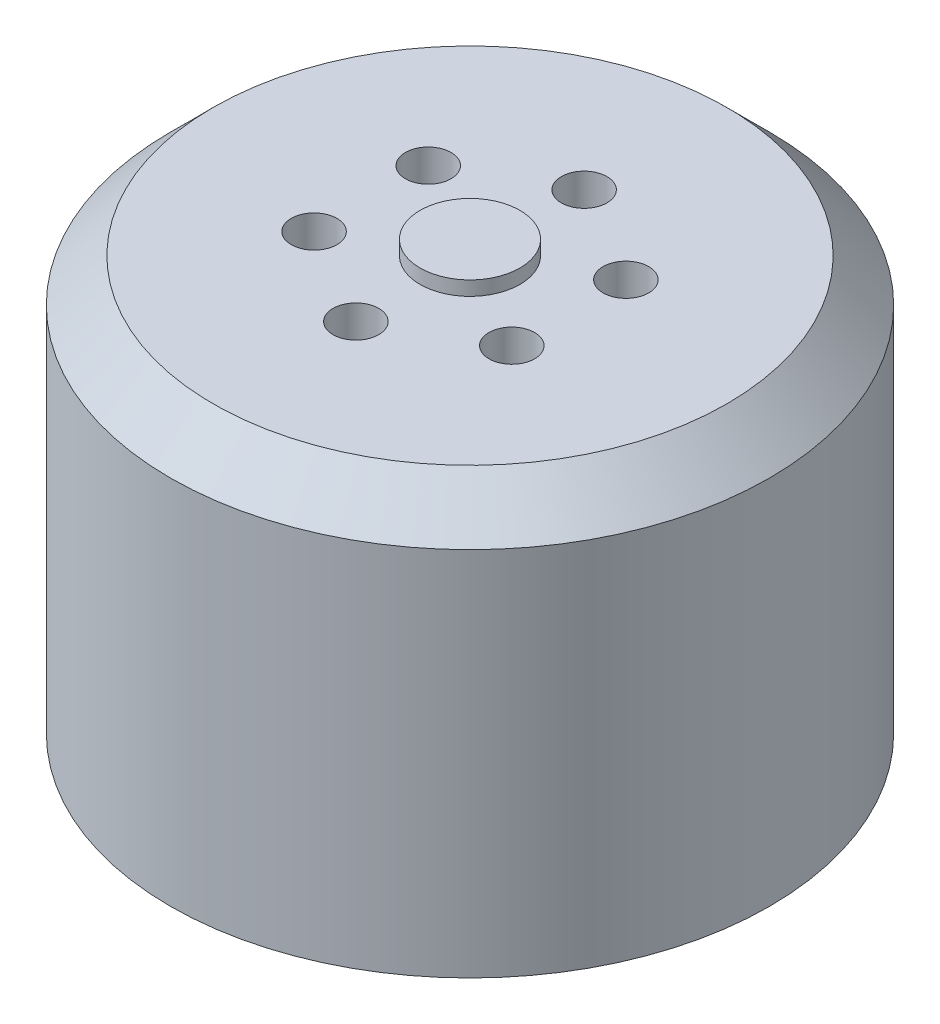
ISO-10303-21;
HEADER;
FILE_DESCRIPTION(('STEP AP214'),'2;1');
FILE_NAME('part.step','',(''),(''),'','','');
FILE_SCHEMA(('AUTOMOTIVE_DESIGN { 1 0 10303 214 1 1 1 1 }'));
ENDSEC;
DATA;
#1=APPLICATION_CONTEXT('core data for automotive mechanical design processes');
#2=APPLICATION_PROTOCOL_DEFINITION('international standard','automotive_design',2000,#1);
#3=PRODUCT_CONTEXT('',#1,'mechanical');
#4=PRODUCT('Part','Part','',(#3));
#5=PRODUCT_RELATED_PRODUCT_CATEGORY('part','',(#4));
#6=PRODUCT_DEFINITION_FORMATION('','',#4);
#7=PRODUCT_DEFINITION_CONTEXT('part definition',#1,'design');
#8=PRODUCT_DEFINITION('design','',#6,#7);
#9=PRODUCT_DEFINITION_SHAPE('','',#8);
#10=(LENGTH_UNIT() NAMED_UNIT(*) SI_UNIT(.MILLI.,.METRE.));
#11=(NAMED_UNIT(*) PLANE_ANGLE_UNIT() SI_UNIT($,.RADIAN.));
#12=(NAMED_UNIT(*) SI_UNIT($,.STERADIAN.) SOLID_ANGLE_UNIT());
#13=UNCERTAINTY_MEASURE_WITH_UNIT(LENGTH_MEASURE(1.E-05),#10,'distance_accuracy_value','');
#14=(GEOMETRIC_REPRESENTATION_CONTEXT(3) GLOBAL_UNCERTAINTY_ASSIGNED_CONTEXT((#13)) GLOBAL_UNIT_ASSIGNED_CONTEXT((#10,
#11,#12)) REPRESENTATION_CONTEXT('',''));
#15=CARTESIAN_POINT('',(0.,0.,0.));
#16=DIRECTION('',(0.,0.,1.));
#17=DIRECTION('',(1.,0.,0.));
#18=AXIS2_PLACEMENT_3D('',#15,#16,#17);
#19=CARTESIAN_POINT('',(-10.,0.,0.));
#20=DIRECTION('',(0.,1.,0.));
#21=DIRECTION('',(-1.,0.,0.));
#22=AXIS2_PLACEMENT_3D('',#19,#20,#21);
#23=PLANE('',#22);
#24=CARTESIAN_POINT('',(0.,0.,0.));
#25=DIRECTION('',(0.,-1.,0.));
#26=DIRECTION('',(1.,0.,0.));
#27=AXIS2_PLACEMENT_3D('',#24,#25,#26);
#28=CIRCLE('',#27,10.);
#29=CARTESIAN_POINT('',(10.,0.,0.));
#30=VERTEX_POINT('',#29);
#31=EDGE_CURVE('E59',#30,#30,#28,.T.);
#32=ORIENTED_EDGE('',*,*,#31,.T.);
#33=EDGE_LOOP('',(#32));
#34=FACE_BOUND('',#33,.T.);
#35=ADVANCED_FACE('F37',(#34),#23,.F.);
#36=CARTESIAN_POINT('',(0.,30.5,0.));
#37=DIRECTION('',(0.,-1.,0.));
#38=DIRECTION('',(1.,0.,0.));
#39=AXIS2_PLACEMENT_3D('',#36,#37,#38);
#40=PLANE('',#39);
#41=CARTESIAN_POINT('',(0.,30.5,0.));
#42=DIRECTION('',(0.,-1.,0.));
#43=DIRECTION('',(1.,0.,0.));
#44=AXIS2_PLACEMENT_3D('',#41,#42,#43);
#45=CIRCLE('',#44,3.5);
#46=CARTESIAN_POINT('',(3.5,30.5,0.));
#47=VERTEX_POINT('',#46);
#48=EDGE_CURVE('E10',#47,#47,#45,.F.);
#49=ORIENTED_EDGE('',*,*,#48,.F.);
#50=EDGE_LOOP('',(#49));
#51=FACE_BOUND('',#50,.T.);
#52=CARTESIAN_POINT('',(0.,30.5,-8.));
#53=DIRECTION('',(0.,1.,0.));
#54=DIRECTION('',(0.,0.,1.));
#55=AXIS2_PLACEMENT_3D('',#52,#53,#54);
#56=CIRCLE('',#55,1.6);
#57=CARTESIAN_POINT('',(0.,30.5,-6.4));
#58=VERTEX_POINT('',#57);
#59=EDGE_CURVE('E88',#58,#58,#56,.T.);
#60=ORIENTED_EDGE('',*,*,#59,.F.);
#61=EDGE_LOOP('',(#60));
#62=FACE_BOUND('',#61,.T.);
#63=CARTESIAN_POINT('',(-6.92820323027551,30.5,-4.));
#64=DIRECTION('',(0.,1.,0.));
#65=DIRECTION('',(0.,0.,1.));
#66=AXIS2_PLACEMENT_3D('',#63,#64,#65);
#67=CIRCLE('',#66,1.6);
#68=CARTESIAN_POINT('',(-6.92820323027551,30.5,-2.4));
#69=VERTEX_POINT('',#68);
#70=EDGE_CURVE('E67',#69,#69,#67,.T.);
#71=ORIENTED_EDGE('',*,*,#70,.F.);
#72=EDGE_LOOP('',(#71));
#73=FACE_BOUND('',#72,.T.);
#74=CARTESIAN_POINT('',(-6.92820323027551,30.5,4.));
#75=DIRECTION('',(0.,1.,0.));
#76=DIRECTION('',(0.,0.,1.));
#77=AXIS2_PLACEMENT_3D('',#74,#75,#76);
#78=CIRCLE('',#77,1.6);
#79=CARTESIAN_POINT('',(-6.92820323027551,30.5,5.6));
#80=VERTEX_POINT('',#79);
#81=EDGE_CURVE('E66',#80,#80,#78,.T.);
#82=ORIENTED_EDGE('',*,*,#81,.F.);
#83=EDGE_LOOP('',(#82));
#84=FACE_BOUND('',#83,.T.);
#85=CARTESIAN_POINT('',(0.,30.5,8.));
#86=DIRECTION('',(0.,1.,0.));
#87=DIRECTION('',(0.,0.,1.));
#88=AXIS2_PLACEMENT_3D('',#85,#86,#87);
#89=CIRCLE('',#88,1.6);
#90=CARTESIAN_POINT('',(0.,30.5,9.6));
#91=VERTEX_POINT('',#90);
#92=EDGE_CURVE('E73',#91,#91,#89,.T.);
#93=ORIENTED_EDGE('',*,*,#92,.F.);
#94=EDGE_LOOP('',(#93));
#95=FACE_BOUND('',#94,.T.);
#96=CARTESIAN_POINT('',(6.92820323027551,30.5,4.));
#97=DIRECTION('',(0.,1.,0.));
#98=DIRECTION('',(0.,0.,1.));
#99=AXIS2_PLACEMENT_3D('',#96,#97,#98);
#100=CIRCLE('',#99,1.6);
#101=CARTESIAN_POINT('',(6.92820323027551,30.5,5.6));
#102=VERTEX_POINT('',#101);
#103=EDGE_CURVE('E79',#102,#102,#100,.T.);
#104=ORIENTED_EDGE('',*,*,#103,.F.);
#105=EDGE_LOOP('',(#104));
#106=FACE_BOUND('',#105,.T.);
#107=CARTESIAN_POINT('',(6.92820323027551,30.5,-4.));
#108=DIRECTION('',(0.,1.,0.));
#109=DIRECTION('',(0.,0.,1.));
#110=AXIS2_PLACEMENT_3D('',#107,#108,#109);
#111=CIRCLE('',#110,1.6);
#112=CARTESIAN_POINT('',(6.92820323027551,30.5,-2.4));
#113=VERTEX_POINT('',#112);
#114=EDGE_CURVE('E85',#113,#113,#111,.T.);
#115=ORIENTED_EDGE('',*,*,#114,.F.);
#116=EDGE_LOOP('',(#115));
#117=FACE_BOUND('',#116,.T.);
#118=CARTESIAN_POINT('',(0.,30.5,0.));
#119=DIRECTION('',(0.,-1.,0.));
#120=DIRECTION('',(1.,0.,0.));
#121=AXIS2_PLACEMENT_3D('',#118,#119,#120);
#122=CIRCLE('',#121,18.);
#123=CARTESIAN_POINT('',(18.,30.5,0.));
#124=VERTEX_POINT('',#123);
#125=EDGE_CURVE('E43',#124,#124,#122,.T.);
#126=ORIENTED_EDGE('',*,*,#125,.F.);
#127=EDGE_LOOP('',(#126));
#128=FACE_BOUND('',#127,.T.);
#129=ADVANCED_FACE('F142',(#51,#62,#73,#84,#95,#106,#117,#128),#40,.F.);
#130=CARTESIAN_POINT('',(0.,30.5,0.));
#131=DIRECTION('',(0.,-1.,0.));
#132=DIRECTION('',(1.,0.,0.));
#133=AXIS2_PLACEMENT_3D('',#130,#131,#132);
#134=CONICAL_SURFACE('',#133,18.,0.785398163397448);
#135=CARTESIAN_POINT('',(0.,27.5,0.));
#136=DIRECTION('',(0.,-1.,0.));
#137=DIRECTION('',(1.,0.,0.));
#138=AXIS2_PLACEMENT_3D('',#135,#136,#137);
#139=CIRCLE('',#138,21.);
#140=CARTESIAN_POINT('',(21.,27.5,0.));
#141=VERTEX_POINT('',#140);
#142=EDGE_CURVE('E47',#141,#141,#139,.T.);
#143=ORIENTED_EDGE('',*,*,#142,.F.);
#144=EDGE_LOOP('',(#143));
#145=FACE_BOUND('',#144,.T.);
#146=ORIENTED_EDGE('',*,*,#125,.T.);
#147=EDGE_LOOP('',(#146));
#148=FACE_BOUND('',#147,.T.);
#149=ADVANCED_FACE('F147',(#145,#148),#134,.T.);
#150=CARTESIAN_POINT('',(0.,0.,0.));
#151=DIRECTION('',(0.,-1.,0.));
#152=DIRECTION('',(1.,0.,0.));
#153=AXIS2_PLACEMENT_3D('',#150,#151,#152);
#154=CYLINDRICAL_SURFACE('',#153,21.);
#155=CARTESIAN_POINT('',(0.,1.5,0.));
#156=DIRECTION('',(0.,-1.,0.));
#157=DIRECTION('',(1.,0.,0.));
#158=AXIS2_PLACEMENT_3D('',#155,#156,#157);
#159=CIRCLE('',#158,21.);
#160=CARTESIAN_POINT('',(21.,1.5,0.));
#161=VERTEX_POINT('',#160);
#162=EDGE_CURVE('E51',#161,#161,#159,.T.);
#163=ORIENTED_EDGE('',*,*,#162,.F.);
#164=EDGE_LOOP('',(#163));
#165=FACE_BOUND('',#164,.T.);
#166=ORIENTED_EDGE('',*,*,#142,.T.);
#167=EDGE_LOOP('',(#166));
#168=FACE_BOUND('',#167,.T.);
#169=ADVANCED_FACE('F161',(#165,#168),#154,.T.);
#170=CARTESIAN_POINT('',(-21.,1.5,0.));
#171=DIRECTION('',(0.,1.,0.));
#172=DIRECTION('',(-1.,0.,0.));
#173=AXIS2_PLACEMENT_3D('',#170,#171,#172);
#174=PLANE('',#173);
#175=CARTESIAN_POINT('',(0.,1.5,18.));
#176=DIRECTION('',(0.,-1.,0.));
#177=DIRECTION('',(0.,0.,-1.));
#178=AXIS2_PLACEMENT_3D('',#175,#176,#177);
#179=CIRCLE('',#178,1.6);
#180=CARTESIAN_POINT('',(0.,1.5,16.4));
#181=VERTEX_POINT('',#180);
#182=EDGE_CURVE('E118',#181,#181,#179,.T.);
#183=ORIENTED_EDGE('',*,*,#182,.F.);
#184=EDGE_LOOP('',(#183));
#185=FACE_BOUND('',#184,.T.);
#186=CARTESIAN_POINT('',(18.,1.5,0.));
#187=DIRECTION('',(0.,-1.,0.));
#188=DIRECTION('',(0.,0.,-1.));
#189=AXIS2_PLACEMENT_3D('',#186,#187,#188);
#190=CIRCLE('',#189,1.6);
#191=CARTESIAN_POINT('',(18.,1.5,-1.6));
#192=VERTEX_POINT('',#191);
#193=EDGE_CURVE('E115',#192,#192,#190,.T.);
#194=ORIENTED_EDGE('',*,*,#193,.F.);
#195=EDGE_LOOP('',(#194));
#196=FACE_BOUND('',#195,.T.);
#197=CARTESIAN_POINT('',(0.,1.5,-18.));
#198=DIRECTION('',(0.,-1.,0.));
#199=DIRECTION('',(0.,0.,-1.));
#200=AXIS2_PLACEMENT_3D('',#197,#198,#199);
#201=CIRCLE('',#200,1.6);
#202=CARTESIAN_POINT('',(0.,1.5,-19.6));
#203=VERTEX_POINT('',#202);
#204=EDGE_CURVE('E109',#203,#203,#201,.T.);
#205=ORIENTED_EDGE('',*,*,#204,.F.);
#206=EDGE_LOOP('',(#205));
#207=FACE_BOUND('',#206,.T.);
#208=CARTESIAN_POINT('',(-18.,1.5,0.));
#209=DIRECTION('',(0.,-1.,0.));
#210=DIRECTION('',(0.,0.,-1.));
#211=AXIS2_PLACEMENT_3D('',#208,#209,#210);
#212=CIRCLE('',#211,1.6);
#213=CARTESIAN_POINT('',(-18.,1.5,-1.6));
#214=VERTEX_POINT('',#213);
#215=EDGE_CURVE('E102',#214,#214,#212,.T.);
#216=ORIENTED_EDGE('',*,*,#215,.F.);
#217=EDGE_LOOP('',(#216));
#218=FACE_BOUND('',#217,.T.);
#219=CARTESIAN_POINT('',(0.,1.5,0.));
#220=DIRECTION('',(0.,-1.,0.));
#221=DIRECTION('',(1.,0.,0.));
#222=AXIS2_PLACEMENT_3D('',#219,#220,#221);
#223=CIRCLE('',#222,10.);
#224=CARTESIAN_POINT('',(10.,1.5,0.));
#225=VERTEX_POINT('',#224);
#226=EDGE_CURVE('E56',#225,#225,#223,.T.);
#227=ORIENTED_EDGE('',*,*,#226,.F.);
#228=EDGE_LOOP('',(#227));
#229=FACE_BOUND('',#228,.T.);
#230=ORIENTED_EDGE('',*,*,#162,.T.);
#231=EDGE_LOOP('',(#230));
#232=FACE_BOUND('',#231,.T.);
#233=ADVANCED_FACE('F155',(#185,#196,#207,#218,#229,#232),#174,.F.);
#234=CARTESIAN_POINT('',(0.,0.,0.));
#235=DIRECTION('',(0.,-1.,0.));
#236=DIRECTION('',(1.,0.,0.));
#237=AXIS2_PLACEMENT_3D('',#234,#235,#236);
#238=CYLINDRICAL_SURFACE('',#237,10.);
#239=ORIENTED_EDGE('',*,*,#31,.F.);
#240=EDGE_LOOP('',(#239));
#241=FACE_BOUND('',#240,.T.);
#242=ORIENTED_EDGE('',*,*,#226,.T.);
#243=EDGE_LOOP('',(#242));
#244=FACE_BOUND('',#243,.T.);
#245=ADVANCED_FACE('F151',(#241,#244),#238,.T.);
#246=CARTESIAN_POINT('',(6.92820323027551,25.5,-4.));
#247=DIRECTION('',(0.,1.,0.));
#248=DIRECTION('',(0.,0.,1.));
#249=AXIS2_PLACEMENT_3D('',#246,#247,#248);
#250=CYLINDRICAL_SURFACE('',#249,1.6);
#251=CARTESIAN_POINT('',(6.92820323027551,25.5,-4.));
#252=DIRECTION('',(0.,1.,0.));
#253=DIRECTION('',(0.,0.,1.));
#254=AXIS2_PLACEMENT_3D('',#251,#252,#253);
#255=CIRCLE('',#254,1.6);
#256=CARTESIAN_POINT('',(6.92820323027551,25.5,-2.4));
#257=VERTEX_POINT('',#256);
#258=EDGE_CURVE('E82',#257,#257,#255,.T.);
#259=ORIENTED_EDGE('',*,*,#258,.F.);
#260=EDGE_LOOP('',(#259));
#261=FACE_BOUND('',#260,.T.);
#262=ORIENTED_EDGE('',*,*,#114,.T.);
#263=EDGE_LOOP('',(#262));
#264=FACE_BOUND('',#263,.T.);
#265=ADVANCED_FACE('F154',(#261,#264),#250,.F.);
#266=CARTESIAN_POINT('',(6.92820323027551,25.5,-4.));
#267=DIRECTION('',(0.,1.,0.));
#268=DIRECTION('',(0.,0.,1.));
#269=AXIS2_PLACEMENT_3D('',#266,#267,#268);
#270=PLANE('',#269);
#271=ORIENTED_EDGE('',*,*,#258,.T.);
#272=EDGE_LOOP('',(#271));
#273=FACE_BOUND('',#272,.T.);
#274=ADVANCED_FACE('F199',(#273),#270,.T.);
#275=CARTESIAN_POINT('',(6.92820323027551,25.5,4.));
#276=DIRECTION('',(0.,1.,0.));
#277=DIRECTION('',(0.,0.,1.));
#278=AXIS2_PLACEMENT_3D('',#275,#276,#277);
#279=CYLINDRICAL_SURFACE('',#278,1.6);
#280=CARTESIAN_POINT('',(6.92820323027551,25.5,4.));
#281=DIRECTION('',(0.,1.,0.));
#282=DIRECTION('',(0.,0.,1.));
#283=AXIS2_PLACEMENT_3D('',#280,#281,#282);
#284=CIRCLE('',#283,1.6);
#285=CARTESIAN_POINT('',(6.92820323027551,25.5,5.6));
#286=VERTEX_POINT('',#285);
#287=EDGE_CURVE('E76',#286,#286,#284,.T.);
#288=ORIENTED_EDGE('',*,*,#287,.F.);
#289=EDGE_LOOP('',(#288));
#290=FACE_BOUND('',#289,.T.);
#291=ORIENTED_EDGE('',*,*,#103,.T.);
#292=EDGE_LOOP('',(#291));
#293=FACE_BOUND('',#292,.T.);
#294=ADVANCED_FACE('F195',(#290,#293),#279,.F.);
#295=CARTESIAN_POINT('',(6.92820323027551,25.5,4.));
#296=DIRECTION('',(0.,1.,0.));
#297=DIRECTION('',(0.,0.,1.));
#298=AXIS2_PLACEMENT_3D('',#295,#296,#297);
#299=PLANE('',#298);
#300=ORIENTED_EDGE('',*,*,#287,.T.);
#301=EDGE_LOOP('',(#300));
#302=FACE_BOUND('',#301,.T.);
#303=ADVANCED_FACE('F191',(#302),#299,.T.);
#304=CARTESIAN_POINT('',(0.,25.5,8.));
#305=DIRECTION('',(0.,1.,0.));
#306=DIRECTION('',(0.,0.,1.));
#307=AXIS2_PLACEMENT_3D('',#304,#305,#306);
#308=CYLINDRICAL_SURFACE('',#307,1.6);
#309=CARTESIAN_POINT('',(0.,25.5,8.));
#310=DIRECTION('',(0.,1.,0.));
#311=DIRECTION('',(0.,0.,1.));
#312=AXIS2_PLACEMENT_3D('',#309,#310,#311);
#313=CIRCLE('',#312,1.6);
#314=CARTESIAN_POINT('',(0.,25.5,9.6));
#315=VERTEX_POINT('',#314);
#316=EDGE_CURVE('E70',#315,#315,#313,.T.);
#317=ORIENTED_EDGE('',*,*,#316,.F.);
#318=EDGE_LOOP('',(#317));
#319=FACE_BOUND('',#318,.T.);
#320=ORIENTED_EDGE('',*,*,#92,.T.);
#321=EDGE_LOOP('',(#320));
#322=FACE_BOUND('',#321,.T.);
#323=ADVANCED_FACE('F187',(#319,#322),#308,.F.);
#324=CARTESIAN_POINT('',(0.,25.5,8.));
#325=DIRECTION('',(0.,1.,0.));
#326=DIRECTION('',(0.,0.,1.));
#327=AXIS2_PLACEMENT_3D('',#324,#325,#326);
#328=PLANE('',#327);
#329=ORIENTED_EDGE('',*,*,#316,.T.);
#330=EDGE_LOOP('',(#329));
#331=FACE_BOUND('',#330,.T.);
#332=ADVANCED_FACE('F183',(#331),#328,.T.);
#333=CARTESIAN_POINT('',(-6.92820323027551,25.5,4.));
#334=DIRECTION('',(0.,1.,0.));
#335=DIRECTION('',(0.,0.,1.));
#336=AXIS2_PLACEMENT_3D('',#333,#334,#335);
#337=CYLINDRICAL_SURFACE('',#336,1.6);
#338=CARTESIAN_POINT('',(-6.92820323027551,25.5,4.));
#339=DIRECTION('',(0.,1.,0.));
#340=DIRECTION('',(0.,0.,1.));
#341=AXIS2_PLACEMENT_3D('',#338,#339,#340);
#342=CIRCLE('',#341,1.6);
#343=CARTESIAN_POINT('',(-6.92820323027551,25.5,5.6));
#344=VERTEX_POINT('',#343);
#345=EDGE_CURVE('E63',#344,#344,#342,.T.);
#346=ORIENTED_EDGE('',*,*,#345,.F.);
#347=EDGE_LOOP('',(#346));
#348=FACE_BOUND('',#347,.T.);
#349=ORIENTED_EDGE('',*,*,#81,.T.);
#350=EDGE_LOOP('',(#349));
#351=FACE_BOUND('',#350,.T.);
#352=ADVANCED_FACE('F179',(#348,#351),#337,.F.);
#353=CARTESIAN_POINT('',(-6.92820323027551,25.5,4.));
#354=DIRECTION('',(0.,1.,0.));
#355=DIRECTION('',(0.,0.,1.));
#356=AXIS2_PLACEMENT_3D('',#353,#354,#355);
#357=PLANE('',#356);
#358=ORIENTED_EDGE('',*,*,#345,.T.);
#359=EDGE_LOOP('',(#358));
#360=FACE_BOUND('',#359,.T.);
#361=ADVANCED_FACE('F175',(#360),#357,.T.);
#362=CARTESIAN_POINT('',(-6.92820323027551,25.5,-4.));
#363=DIRECTION('',(0.,1.,0.));
#364=DIRECTION('',(0.,0.,1.));
#365=AXIS2_PLACEMENT_3D('',#362,#363,#364);
#366=CYLINDRICAL_SURFACE('',#365,1.6);
#367=CARTESIAN_POINT('',(-6.92820323027551,25.5,-4.));
#368=DIRECTION('',(0.,1.,0.));
#369=DIRECTION('',(0.,0.,1.));
#370=AXIS2_PLACEMENT_3D('',#367,#368,#369);
#371=CIRCLE('',#370,1.6);
#372=CARTESIAN_POINT('',(-6.92820323027551,25.5,-2.4));
#373=VERTEX_POINT('',#372);
#374=EDGE_CURVE('E89',#373,#373,#371,.T.);
#375=ORIENTED_EDGE('',*,*,#374,.F.);
#376=EDGE_LOOP('',(#375));
#377=FACE_BOUND('',#376,.T.);
#378=ORIENTED_EDGE('',*,*,#70,.T.);
#379=EDGE_LOOP('',(#378));
#380=FACE_BOUND('',#379,.T.);
#381=ADVANCED_FACE('F178',(#377,#380),#366,.F.);
#382=CARTESIAN_POINT('',(-6.92820323027551,25.5,-4.));
#383=DIRECTION('',(0.,1.,0.));
#384=DIRECTION('',(0.,0.,1.));
#385=AXIS2_PLACEMENT_3D('',#382,#383,#384);
#386=PLANE('',#385);
#387=ORIENTED_EDGE('',*,*,#374,.T.);
#388=EDGE_LOOP('',(#387));
#389=FACE_BOUND('',#388,.T.);
#390=ADVANCED_FACE('F207',(#389),#386,.T.);
#391=CARTESIAN_POINT('',(0.,25.5,-8.));
#392=DIRECTION('',(0.,1.,0.));
#393=DIRECTION('',(0.,0.,1.));
#394=AXIS2_PLACEMENT_3D('',#391,#392,#393);
#395=CYLINDRICAL_SURFACE('',#394,1.6);
#396=CARTESIAN_POINT('',(0.,25.5,-8.));
#397=DIRECTION('',(0.,1.,0.));
#398=DIRECTION('',(0.,0.,1.));
#399=AXIS2_PLACEMENT_3D('',#396,#397,#398);
#400=CIRCLE('',#399,1.6);
#401=CARTESIAN_POINT('',(0.,25.5,-6.4));
#402=VERTEX_POINT('',#401);
#403=EDGE_CURVE('E62',#402,#402,#400,.T.);
#404=ORIENTED_EDGE('',*,*,#403,.F.);
#405=EDGE_LOOP('',(#404));
#406=FACE_BOUND('',#405,.T.);
#407=ORIENTED_EDGE('',*,*,#59,.T.);
#408=EDGE_LOOP('',(#407));
#409=FACE_BOUND('',#408,.T.);
#410=ADVANCED_FACE('F210',(#406,#409),#395,.F.);
#411=CARTESIAN_POINT('',(0.,25.5,-8.));
#412=DIRECTION('',(0.,1.,0.));
#413=DIRECTION('',(0.,0.,1.));
#414=AXIS2_PLACEMENT_3D('',#411,#412,#413);
#415=PLANE('',#414);
#416=ORIENTED_EDGE('',*,*,#403,.T.);
#417=EDGE_LOOP('',(#416));
#418=FACE_BOUND('',#417,.T.);
#419=ADVANCED_FACE('F217',(#418),#415,.T.);
#420=CARTESIAN_POINT('',(-18.,6.5,0.));
#421=DIRECTION('',(0.,-1.,0.));
#422=DIRECTION('',(0.,0.,-1.));
#423=AXIS2_PLACEMENT_3D('',#420,#421,#422);
#424=CYLINDRICAL_SURFACE('',#423,1.6);
#425=CARTESIAN_POINT('',(-18.,6.5,0.));
#426=DIRECTION('',(0.,-1.,0.));
#427=DIRECTION('',(0.,0.,-1.));
#428=AXIS2_PLACEMENT_3D('',#425,#426,#427);
#429=CIRCLE('',#428,1.6);
#430=CARTESIAN_POINT('',(-18.,6.5,-1.6));
#431=VERTEX_POINT('',#430);
#432=EDGE_CURVE('E99',#431,#431,#429,.T.);
#433=ORIENTED_EDGE('',*,*,#432,.F.);
#434=EDGE_LOOP('',(#433));
#435=FACE_BOUND('',#434,.T.);
#436=ORIENTED_EDGE('',*,*,#215,.T.);
#437=EDGE_LOOP('',(#436));
#438=FACE_BOUND('',#437,.T.);
#439=ADVANCED_FACE('F221',(#435,#438),#424,.F.);
#440=CARTESIAN_POINT('',(-18.,6.5,0.));
#441=DIRECTION('',(0.,-1.,0.));
#442=DIRECTION('',(0.,0.,-1.));
#443=AXIS2_PLACEMENT_3D('',#440,#441,#442);
#444=PLANE('',#443);
#445=ORIENTED_EDGE('',*,*,#432,.T.);
#446=EDGE_LOOP('',(#445));
#447=FACE_BOUND('',#446,.T.);
#448=ADVANCED_FACE('F223',(#447),#444,.T.);
#449=CARTESIAN_POINT('',(0.,6.5,-18.));
#450=DIRECTION('',(0.,-1.,0.));
#451=DIRECTION('',(0.,0.,-1.));
#452=AXIS2_PLACEMENT_3D('',#449,#450,#451);
#453=CYLINDRICAL_SURFACE('',#452,1.6);
#454=CARTESIAN_POINT('',(0.,6.5,-18.));
#455=DIRECTION('',(0.,-1.,0.));
#456=DIRECTION('',(0.,0.,-1.));
#457=AXIS2_PLACEMENT_3D('',#454,#455,#456);
#458=CIRCLE('',#457,1.6);
#459=CARTESIAN_POINT('',(0.,6.5,-19.6));
#460=VERTEX_POINT('',#459);
#461=EDGE_CURVE('E106',#460,#460,#458,.T.);
#462=ORIENTED_EDGE('',*,*,#461,.F.);
#463=EDGE_LOOP('',(#462));
#464=FACE_BOUND('',#463,.T.);
#465=ORIENTED_EDGE('',*,*,#204,.T.);
#466=EDGE_LOOP('',(#465));
#467=FACE_BOUND('',#466,.T.);
#468=ADVANCED_FACE('F226',(#464,#467),#453,.F.);
#469=CARTESIAN_POINT('',(0.,6.5,-18.));
#470=DIRECTION('',(0.,-1.,0.));
#471=DIRECTION('',(0.,0.,-1.));
#472=AXIS2_PLACEMENT_3D('',#469,#470,#471);
#473=PLANE('',#472);
#474=ORIENTED_EDGE('',*,*,#461,.T.);
#475=EDGE_LOOP('',(#474));
#476=FACE_BOUND('',#475,.T.);
#477=ADVANCED_FACE('F231',(#476),#473,.T.);
#478=CARTESIAN_POINT('',(18.,6.5,0.));
#479=DIRECTION('',(0.,-1.,0.));
#480=DIRECTION('',(0.,0.,-1.));
#481=AXIS2_PLACEMENT_3D('',#478,#479,#480);
#482=CYLINDRICAL_SURFACE('',#481,1.6);
#483=CARTESIAN_POINT('',(18.,6.5,0.));
#484=DIRECTION('',(0.,-1.,0.));
#485=DIRECTION('',(0.,0.,-1.));
#486=AXIS2_PLACEMENT_3D('',#483,#484,#485);
#487=CIRCLE('',#486,1.6);
#488=CARTESIAN_POINT('',(18.,6.5,-1.6));
#489=VERTEX_POINT('',#488);
#490=EDGE_CURVE('E112',#489,#489,#487,.T.);
#491=ORIENTED_EDGE('',*,*,#490,.F.);
#492=EDGE_LOOP('',(#491));
#493=FACE_BOUND('',#492,.T.);
#494=ORIENTED_EDGE('',*,*,#193,.T.);
#495=EDGE_LOOP('',(#494));
#496=FACE_BOUND('',#495,.T.);
#497=ADVANCED_FACE('F234',(#493,#496),#482,.F.);
#498=CARTESIAN_POINT('',(18.,6.5,0.));
#499=DIRECTION('',(0.,-1.,0.));
#500=DIRECTION('',(0.,0.,-1.));
#501=AXIS2_PLACEMENT_3D('',#498,#499,#500);
#502=PLANE('',#501);
#503=ORIENTED_EDGE('',*,*,#490,.T.);
#504=EDGE_LOOP('',(#503));
#505=FACE_BOUND('',#504,.T.);
#506=ADVANCED_FACE('F239',(#505),#502,.T.);
#507=CARTESIAN_POINT('',(0.,6.5,18.));
#508=DIRECTION('',(0.,-1.,0.));
#509=DIRECTION('',(0.,0.,-1.));
#510=AXIS2_PLACEMENT_3D('',#507,#508,#509);
#511=CYLINDRICAL_SURFACE('',#510,1.6);
#512=CARTESIAN_POINT('',(0.,6.5,18.));
#513=DIRECTION('',(0.,-1.,0.));
#514=DIRECTION('',(0.,0.,-1.));
#515=AXIS2_PLACEMENT_3D('',#512,#513,#514);
#516=CIRCLE('',#515,1.6);
#517=CARTESIAN_POINT('',(0.,6.5,16.4));
#518=VERTEX_POINT('',#517);
#519=EDGE_CURVE('E92',#518,#518,#516,.T.);
#520=ORIENTED_EDGE('',*,*,#519,.F.);
#521=EDGE_LOOP('',(#520));
#522=FACE_BOUND('',#521,.T.);
#523=ORIENTED_EDGE('',*,*,#182,.T.);
#524=EDGE_LOOP('',(#523));
#525=FACE_BOUND('',#524,.T.);
#526=ADVANCED_FACE('F138',(#522,#525),#511,.F.);
#527=CARTESIAN_POINT('',(0.,6.5,18.));
#528=DIRECTION('',(0.,-1.,0.));
#529=DIRECTION('',(0.,0.,-1.));
#530=AXIS2_PLACEMENT_3D('',#527,#528,#529);
#531=PLANE('',#530);
#532=ORIENTED_EDGE('',*,*,#519,.T.);
#533=EDGE_LOOP('',(#532));
#534=FACE_BOUND('',#533,.T.);
#535=ADVANCED_FACE('F130',(#534),#531,.T.);
#536=CARTESIAN_POINT('',(0.,31.5,0.));
#537=DIRECTION('',(0.,-1.,0.));
#538=DIRECTION('',(0.,0.,-1.));
#539=AXIS2_PLACEMENT_3D('',#536,#537,#538);
#540=CYLINDRICAL_SURFACE('',#539,3.5);
#541=CARTESIAN_POINT('',(0.,31.5,0.));
#542=DIRECTION('',(0.,1.,0.));
#543=DIRECTION('',(0.,0.,1.));
#544=AXIS2_PLACEMENT_3D('',#541,#542,#543);
#545=CIRCLE('',#544,3.5);
#546=CARTESIAN_POINT('',(0.,31.5,3.5));
#547=VERTEX_POINT('',#546);
#548=EDGE_CURVE('E103',#547,#547,#545,.T.);
#549=ORIENTED_EDGE('',*,*,#548,.F.);
#550=EDGE_LOOP('',(#549));
#551=FACE_BOUND('',#550,.T.);
#552=ORIENTED_EDGE('',*,*,#48,.T.);
#553=EDGE_LOOP('',(#552));
#554=FACE_BOUND('',#553,.T.);
#555=ADVANCED_FACE('F128',(#551,#554),#540,.T.);
#556=CARTESIAN_POINT('',(0.,31.5,0.));
#557=DIRECTION('',(0.,1.,0.));
#558=DIRECTION('',(0.,0.,1.));
#559=AXIS2_PLACEMENT_3D('',#556,#557,#558);
#560=PLANE('',#559);
#561=ORIENTED_EDGE('',*,*,#548,.T.);
#562=EDGE_LOOP('',(#561));
#563=FACE_BOUND('',#562,.T.);
#564=ADVANCED_FACE('F126',(#563),#560,.T.);
#565=CLOSED_SHELL('',(#35,#129,#149,#169,#233,#245,#265,#274,#294,#303,#323,#332,#352,#361,#381,
#390,#410,#419,#439,#448,#468,#477,#497,#506,#526,#535,#555,#564));
#566=MANIFOLD_SOLID_BREP('B2',#565);
#567=ADVANCED_BREP_SHAPE_REPRESENTATION('',(#18,#566),#14);
#568=SHAPE_DEFINITION_REPRESENTATION(#9,#567);
ENDSEC;
END-ISO-10303-21;
